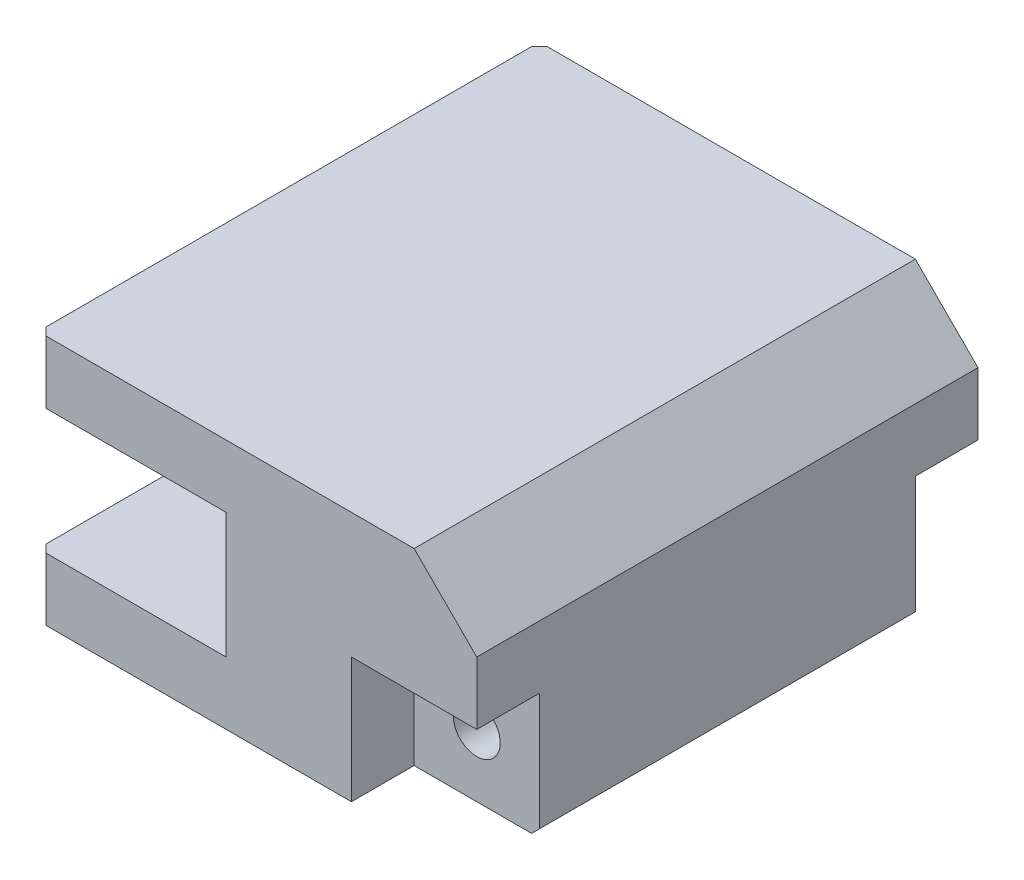
ISO-10303-21;
HEADER;
FILE_DESCRIPTION(('STEP AP214'),'2;1');
FILE_NAME('part.step','',(''),(''),'','','');
FILE_SCHEMA(('AUTOMOTIVE_DESIGN { 1 0 10303 214 1 1 1 1 }'));
ENDSEC;
DATA;
#1=APPLICATION_CONTEXT('core data for automotive mechanical design processes');
#2=APPLICATION_PROTOCOL_DEFINITION('international standard','automotive_design',2000,#1);
#3=PRODUCT_CONTEXT('',#1,'mechanical');
#4=PRODUCT('Part','Part','',(#3));
#5=PRODUCT_RELATED_PRODUCT_CATEGORY('part','',(#4));
#6=PRODUCT_DEFINITION_FORMATION('','',#4);
#7=PRODUCT_DEFINITION_CONTEXT('part definition',#1,'design');
#8=PRODUCT_DEFINITION('design','',#6,#7);
#9=PRODUCT_DEFINITION_SHAPE('','',#8);
#10=(LENGTH_UNIT() NAMED_UNIT(*) SI_UNIT(.MILLI.,.METRE.));
#11=(NAMED_UNIT(*) PLANE_ANGLE_UNIT() SI_UNIT($,.RADIAN.));
#12=(NAMED_UNIT(*) SI_UNIT($,.STERADIAN.) SOLID_ANGLE_UNIT());
#13=UNCERTAINTY_MEASURE_WITH_UNIT(LENGTH_MEASURE(1.E-05),#10,'distance_accuracy_value','');
#14=(GEOMETRIC_REPRESENTATION_CONTEXT(3) GLOBAL_UNCERTAINTY_ASSIGNED_CONTEXT((#13)) GLOBAL_UNIT_ASSIGNED_CONTEXT((#10,
#11,#12)) REPRESENTATION_CONTEXT('',''));
#15=CARTESIAN_POINT('',(0.,0.,0.));
#16=DIRECTION('',(0.,0.,1.));
#17=DIRECTION('',(1.,0.,0.));
#18=AXIS2_PLACEMENT_3D('',#15,#16,#17);
#19=CARTESIAN_POINT('',(-44.45,-25.4,50.8));
#20=DIRECTION('',(1.,0.,0.));
#21=DIRECTION('',(0.,0.,-1.));
#22=AXIS2_PLACEMENT_3D('',#19,#20,#21);
#23=PLANE('',#22);
#24=DIRECTION('',(0.,0.,-1.));
#25=VECTOR('',#24,1.);
#26=CARTESIAN_POINT('',(-44.45,25.4,50.8));
#27=LINE('',#26,#25);
#28=CARTESIAN_POINT('',(-44.45,25.4,49.2125));
#29=VERTEX_POINT('',#28);
#30=CARTESIAN_POINT('',(-44.45,25.4,-49.2125));
#31=VERTEX_POINT('',#30);
#32=EDGE_CURVE('E271',#29,#31,#27,.T.);
#33=ORIENTED_EDGE('',*,*,#32,.T.);
#34=DIRECTION('',(0.,-1.,0.));
#35=VECTOR('',#34,1.);
#36=CARTESIAN_POINT('',(-44.45,-25.4,-49.2125));
#37=LINE('',#36,#35);
#38=CARTESIAN_POINT('',(-44.45,12.7,-49.2125));
#39=VERTEX_POINT('',#38);
#40=EDGE_CURVE('E320',#31,#39,#37,.T.);
#41=ORIENTED_EDGE('',*,*,#40,.T.);
#42=DIRECTION('',(0.,0.,1.));
#43=VECTOR('',#42,1.);
#44=CARTESIAN_POINT('',(-44.45,12.7,-50.8));
#45=LINE('',#44,#43);
#46=CARTESIAN_POINT('',(-44.45,12.7,49.2125));
#47=VERTEX_POINT('',#46);
#48=EDGE_CURVE('E206',#39,#47,#45,.T.);
#49=ORIENTED_EDGE('',*,*,#48,.T.);
#50=DIRECTION('',(0.,1.,0.));
#51=VECTOR('',#50,1.);
#52=CARTESIAN_POINT('',(-44.45,25.4,49.2125));
#53=LINE('',#52,#51);
#54=EDGE_CURVE('E318',#47,#29,#53,.T.);
#55=ORIENTED_EDGE('',*,*,#54,.T.);
#56=EDGE_LOOP('',(#33,#41,#49,#55));
#57=FACE_BOUND('',#56,.T.);
#58=ADVANCED_FACE('F34',(#57),#23,.F.);
#59=CARTESIAN_POINT('',(44.45,-25.4,50.8));
#60=DIRECTION('',(0.,1.,0.));
#61=DIRECTION('',(-1.,0.,0.));
#62=AXIS2_PLACEMENT_3D('',#59,#60,#61);
#63=PLANE('',#62);
#64=DIRECTION('',(1.,0.,0.));
#65=VECTOR('',#64,1.);
#66=CARTESIAN_POINT('',(44.45,-25.4,50.8));
#67=LINE('',#66,#65);
#68=CARTESIAN_POINT('',(-42.8625,-25.4,50.8));
#69=VERTEX_POINT('',#68);
#70=CARTESIAN_POINT('',(19.05,-25.4,50.8));
#71=VERTEX_POINT('',#70);
#72=EDGE_CURVE('E262',#69,#71,#67,.T.);
#73=ORIENTED_EDGE('',*,*,#72,.F.);
#74=DIRECTION('',(-0.707106781186551,0.,-0.707106781186544));
#75=VECTOR('',#74,1.);
#76=CARTESIAN_POINT('',(-42.8625,-25.4,50.8));
#77=LINE('',#76,#75);
#78=CARTESIAN_POINT('',(-44.45,-25.4,49.2125));
#79=VERTEX_POINT('',#78);
#80=EDGE_CURVE('E304',#69,#79,#77,.T.);
#81=ORIENTED_EDGE('',*,*,#80,.T.);
#82=DIRECTION('',(0.,0.,-1.));
#83=VECTOR('',#82,1.);
#84=CARTESIAN_POINT('',(-44.45,-25.4,50.8));
#85=LINE('',#84,#83);
#86=CARTESIAN_POINT('',(-44.45,-25.4,-49.2125));
#87=VERTEX_POINT('',#86);
#88=EDGE_CURVE('E280',#79,#87,#85,.T.);
#89=ORIENTED_EDGE('',*,*,#88,.T.);
#90=DIRECTION('',(-0.707106781186544,0.,0.707106781186551));
#91=VECTOR('',#90,1.);
#92=CARTESIAN_POINT('',(-44.45,-25.4,-49.2125));
#93=LINE('',#92,#91);
#94=CARTESIAN_POINT('',(-42.8625,-25.4,-50.8));
#95=VERTEX_POINT('',#94);
#96=EDGE_CURVE('E302',#87,#95,#93,.F.);
#97=ORIENTED_EDGE('',*,*,#96,.T.);
#98=DIRECTION('',(1.,0.,0.));
#99=VECTOR('',#98,1.);
#100=CARTESIAN_POINT('',(44.45,-25.4,-50.8));
#101=LINE('',#100,#99);
#102=CARTESIAN_POINT('',(19.05,-25.4,-50.8));
#103=VERTEX_POINT('',#102);
#104=EDGE_CURVE('E258',#95,#103,#101,.T.);
#105=ORIENTED_EDGE('',*,*,#104,.T.);
#106=DIRECTION('',(0.,0.,-1.));
#107=VECTOR('',#106,1.);
#108=CARTESIAN_POINT('',(19.05,-25.4,-38.1));
#109=LINE('',#108,#107);
#110=CARTESIAN_POINT('',(19.05,-25.4,-38.1));
#111=VERTEX_POINT('',#110);
#112=EDGE_CURVE('E222',#111,#103,#109,.T.);
#113=ORIENTED_EDGE('',*,*,#112,.F.);
#114=DIRECTION('',(1.,0.,0.));
#115=VECTOR('',#114,1.);
#116=CARTESIAN_POINT('',(44.45,-25.4,-38.1));
#117=LINE('',#116,#115);
#118=CARTESIAN_POINT('',(42.8625,-25.4,-38.1));
#119=VERTEX_POINT('',#118);
#120=EDGE_CURVE('E214',#111,#119,#117,.T.);
#121=ORIENTED_EDGE('',*,*,#120,.T.);
#122=DIRECTION('',(0.,0.,1.));
#123=VECTOR('',#122,1.);
#124=CARTESIAN_POINT('',(42.8625,-25.4,50.8));
#125=LINE('',#124,#123);
#126=CARTESIAN_POINT('',(42.8625,-25.4,38.1));
#127=VERTEX_POINT('',#126);
#128=EDGE_CURVE('E300',#119,#127,#125,.T.);
#129=ORIENTED_EDGE('',*,*,#128,.T.);
#130=DIRECTION('',(1.,0.,0.));
#131=VECTOR('',#130,1.);
#132=CARTESIAN_POINT('',(44.45,-25.4,38.1));
#133=LINE('',#132,#131);
#134=CARTESIAN_POINT('',(19.05,-25.4,38.1));
#135=VERTEX_POINT('',#134);
#136=EDGE_CURVE('E248',#135,#127,#133,.T.);
#137=ORIENTED_EDGE('',*,*,#136,.F.);
#138=DIRECTION('',(0.,0.,1.));
#139=VECTOR('',#138,1.);
#140=CARTESIAN_POINT('',(19.05,-25.4,38.1));
#141=LINE('',#140,#139);
#142=EDGE_CURVE('E255',#135,#71,#141,.T.);
#143=ORIENTED_EDGE('',*,*,#142,.T.);
#144=EDGE_LOOP('',(#73,#81,#89,#97,#105,#113,#121,#129,#137,#143));
#145=FACE_BOUND('',#144,.T.);
#146=ADVANCED_FACE('F342',(#145),#63,.F.);
#147=CARTESIAN_POINT('',(44.45,-25.4,50.8));
#148=DIRECTION('',(-1.,0.,0.));
#149=DIRECTION('',(0.,0.,1.));
#150=AXIS2_PLACEMENT_3D('',#147,#148,#149);
#151=PLANE('',#150);
#152=DIRECTION('',(0.,1.,0.));
#153=VECTOR('',#152,1.);
#154=CARTESIAN_POINT('',(44.45,-25.4,38.1));
#155=LINE('',#154,#153);
#156=CARTESIAN_POINT('',(44.45,-23.8125,38.1));
#157=VERTEX_POINT('',#156);
#158=CARTESIAN_POINT('',(44.45,0.,38.1));
#159=VERTEX_POINT('',#158);
#160=EDGE_CURVE('E239',#157,#159,#155,.T.);
#161=ORIENTED_EDGE('',*,*,#160,.F.);
#162=DIRECTION('',(0.,0.,-1.));
#163=VECTOR('',#162,1.);
#164=CARTESIAN_POINT('',(44.45,-23.8125,50.8));
#165=LINE('',#164,#163);
#166=CARTESIAN_POINT('',(44.45,-23.8125,-38.1));
#167=VERTEX_POINT('',#166);
#168=EDGE_CURVE('E331',#157,#167,#165,.T.);
#169=ORIENTED_EDGE('',*,*,#168,.T.);
#170=DIRECTION('',(0.,1.,0.));
#171=VECTOR('',#170,1.);
#172=CARTESIAN_POINT('',(44.45,-25.4,-38.1));
#173=LINE('',#172,#171);
#174=CARTESIAN_POINT('',(44.45,0.,-38.1));
#175=VERTEX_POINT('',#174);
#176=EDGE_CURVE('E212',#167,#175,#173,.T.);
#177=ORIENTED_EDGE('',*,*,#176,.T.);
#178=DIRECTION('',(0.,0.,-1.));
#179=VECTOR('',#178,1.);
#180=CARTESIAN_POINT('',(44.45,0.,-38.1));
#181=LINE('',#180,#179);
#182=CARTESIAN_POINT('',(44.45,0.,-50.8));
#183=VERTEX_POINT('',#182);
#184=EDGE_CURVE('E227',#175,#183,#181,.T.);
#185=ORIENTED_EDGE('',*,*,#184,.T.);
#186=DIRECTION('',(0.,1.,0.));
#187=VECTOR('',#186,1.);
#188=CARTESIAN_POINT('',(44.45,-25.4,-50.8));
#189=LINE('',#188,#187);
#190=CARTESIAN_POINT('',(44.45,12.7,-50.8));
#191=VERTEX_POINT('',#190);
#192=EDGE_CURVE('E273',#183,#191,#189,.T.);
#193=ORIENTED_EDGE('',*,*,#192,.T.);
#194=DIRECTION('',(0.,0.,1.));
#195=VECTOR('',#194,1.);
#196=CARTESIAN_POINT('',(44.45,12.7,50.8));
#197=LINE('',#196,#195);
#198=CARTESIAN_POINT('',(44.45,12.7,50.8));
#199=VERTEX_POINT('',#198);
#200=EDGE_CURVE('E290',#191,#199,#197,.T.);
#201=ORIENTED_EDGE('',*,*,#200,.T.);
#202=DIRECTION('',(0.,1.,0.));
#203=VECTOR('',#202,1.);
#204=CARTESIAN_POINT('',(44.45,-25.4,50.8));
#205=LINE('',#204,#203);
#206=CARTESIAN_POINT('',(44.45,0.,50.8));
#207=VERTEX_POINT('',#206);
#208=EDGE_CURVE('E264',#207,#199,#205,.T.);
#209=ORIENTED_EDGE('',*,*,#208,.F.);
#210=DIRECTION('',(0.,0.,1.));
#211=VECTOR('',#210,1.);
#212=CARTESIAN_POINT('',(44.45,0.,38.1));
#213=LINE('',#212,#211);
#214=EDGE_CURVE('E250',#159,#207,#213,.T.);
#215=ORIENTED_EDGE('',*,*,#214,.F.);
#216=EDGE_LOOP('',(#161,#169,#177,#185,#193,#201,#209,#215));
#217=FACE_BOUND('',#216,.T.);
#218=ADVANCED_FACE('F345',(#217),#151,.F.);
#219=CARTESIAN_POINT('',(0.,0.,-50.8));
#220=DIRECTION('',(0.,0.,1.));
#221=DIRECTION('',(1.,0.,0.));
#222=AXIS2_PLACEMENT_3D('',#219,#220,#221);
#223=PLANE('',#222);
#224=ORIENTED_EDGE('',*,*,#104,.F.);
#225=DIRECTION('',(0.,1.,0.));
#226=VECTOR('',#225,1.);
#227=CARTESIAN_POINT('',(-42.8625,0.,-50.8));
#228=LINE('',#227,#226);
#229=CARTESIAN_POINT('',(-42.8625,-12.7,-50.8));
#230=VERTEX_POINT('',#229);
#231=EDGE_CURVE('E178',#95,#230,#228,.T.);
#232=ORIENTED_EDGE('',*,*,#231,.T.);
#233=DIRECTION('',(1.,0.,0.));
#234=VECTOR('',#233,1.);
#235=CARTESIAN_POINT('',(-44.45,-12.7,-50.8));
#236=LINE('',#235,#234);
#237=CARTESIAN_POINT('',(-6.35,-12.7,-50.8));
#238=VERTEX_POINT('',#237);
#239=EDGE_CURVE('E170',#230,#238,#236,.T.);
#240=ORIENTED_EDGE('',*,*,#239,.T.);
#241=DIRECTION('',(0.,1.,0.));
#242=VECTOR('',#241,1.);
#243=CARTESIAN_POINT('',(-6.35,12.7,-50.8));
#244=LINE('',#243,#242);
#245=CARTESIAN_POINT('',(-6.35,12.7,-50.8));
#246=VERTEX_POINT('',#245);
#247=EDGE_CURVE('E176',#238,#246,#244,.T.);
#248=ORIENTED_EDGE('',*,*,#247,.T.);
#249=DIRECTION('',(-1.,0.,0.));
#250=VECTOR('',#249,1.);
#251=CARTESIAN_POINT('',(-44.45,12.7,-50.8));
#252=LINE('',#251,#250);
#253=CARTESIAN_POINT('',(-42.8625,12.7,-50.8));
#254=VERTEX_POINT('',#253);
#255=EDGE_CURVE('E197',#246,#254,#252,.T.);
#256=ORIENTED_EDGE('',*,*,#255,.T.);
#257=DIRECTION('',(0.,1.,0.));
#258=VECTOR('',#257,1.);
#259=CARTESIAN_POINT('',(-42.8625,0.,-50.8));
#260=LINE('',#259,#258);
#261=CARTESIAN_POINT('',(-42.8625,25.4,-50.8));
#262=VERTEX_POINT('',#261);
#263=EDGE_CURVE('E315',#254,#262,#260,.T.);
#264=ORIENTED_EDGE('',*,*,#263,.T.);
#265=DIRECTION('',(-1.,0.,0.));
#266=VECTOR('',#265,1.);
#267=CARTESIAN_POINT('',(44.45,25.4,-50.8));
#268=LINE('',#267,#266);
#269=CARTESIAN_POINT('',(31.75,25.4,-50.8));
#270=VERTEX_POINT('',#269);
#271=EDGE_CURVE('E265',#270,#262,#268,.T.);
#272=ORIENTED_EDGE('',*,*,#271,.F.);
#273=DIRECTION('',(-0.707106781186546,0.707106781186549,0.));
#274=VECTOR('',#273,1.);
#275=CARTESIAN_POINT('',(31.75,25.4,-50.8));
#276=LINE('',#275,#274);
#277=EDGE_CURVE('E288',#270,#191,#276,.F.);
#278=ORIENTED_EDGE('',*,*,#277,.T.);
#279=ORIENTED_EDGE('',*,*,#192,.F.);
#280=DIRECTION('',(-1.,0.,0.));
#281=VECTOR('',#280,1.);
#282=CARTESIAN_POINT('',(44.45,0.,-50.8));
#283=LINE('',#282,#281);
#284=CARTESIAN_POINT('',(19.05,0.,-50.8));
#285=VERTEX_POINT('',#284);
#286=EDGE_CURVE('E215',#183,#285,#283,.T.);
#287=ORIENTED_EDGE('',*,*,#286,.T.);
#288=DIRECTION('',(0.,-1.,0.));
#289=VECTOR('',#288,1.);
#290=CARTESIAN_POINT('',(19.05,-25.4,-50.8));
#291=LINE('',#290,#289);
#292=EDGE_CURVE('E209',#285,#103,#291,.T.);
#293=ORIENTED_EDGE('',*,*,#292,.T.);
#294=EDGE_LOOP('',(#224,#232,#240,#248,#256,#264,#272,#278,#279,#287,#293));
#295=FACE_BOUND('',#294,.T.);
#296=ADVANCED_FACE('F173',(#295),#223,.F.);
#297=CARTESIAN_POINT('',(31.75,-12.7,-50.8));
#298=DIRECTION('',(0.,0.,1.));
#299=DIRECTION('',(1.,0.,0.));
#300=AXIS2_PLACEMENT_3D('',#297,#298,#299);
#301=CYLINDRICAL_SURFACE('',#300,4.7625);
#302=CARTESIAN_POINT('',(31.75,-12.7,38.1));
#303=DIRECTION('',(0.,0.,1.));
#304=DIRECTION('',(1.,0.,0.));
#305=AXIS2_PLACEMENT_3D('',#302,#303,#304);
#306=CIRCLE('',#305,4.7625);
#307=CARTESIAN_POINT('',(36.5125,-12.7,38.1));
#308=VERTEX_POINT('',#307);
#309=EDGE_CURVE('E235',#308,#308,#306,.T.);
#310=ORIENTED_EDGE('',*,*,#309,.T.);
#311=EDGE_LOOP('',(#310));
#312=FACE_BOUND('',#311,.T.);
#313=CARTESIAN_POINT('',(31.75,-12.7,-38.1));
#314=DIRECTION('',(0.,0.,-1.));
#315=DIRECTION('',(-1.,0.,0.));
#316=AXIS2_PLACEMENT_3D('',#313,#314,#315);
#317=CIRCLE('',#316,4.7625);
#318=CARTESIAN_POINT('',(26.9875,-12.7,-38.1));
#319=VERTEX_POINT('',#318);
#320=EDGE_CURVE('E230',#319,#319,#317,.F.);
#321=ORIENTED_EDGE('',*,*,#320,.F.);
#322=EDGE_LOOP('',(#321));
#323=FACE_BOUND('',#322,.T.);
#324=ADVANCED_FACE('F419',(#312,#323),#301,.F.);
#325=ORIENTED_EDGE('',*,*,#88,.F.);
#326=DIRECTION('',(0.,1.,0.));
#327=VECTOR('',#326,1.);
#328=CARTESIAN_POINT('',(-44.45,-12.7,49.2125));
#329=LINE('',#328,#327);
#330=CARTESIAN_POINT('',(-44.45,-12.7,49.2125));
#331=VERTEX_POINT('',#330);
#332=EDGE_CURVE('E309',#79,#331,#329,.T.);
#333=ORIENTED_EDGE('',*,*,#332,.T.);
#334=DIRECTION('',(0.,0.,1.));
#335=VECTOR('',#334,1.);
#336=CARTESIAN_POINT('',(-44.45,-12.7,-50.8));
#337=LINE('',#336,#335);
#338=CARTESIAN_POINT('',(-44.45,-12.7,-49.2125));
#339=VERTEX_POINT('',#338);
#340=EDGE_CURVE('E193',#339,#331,#337,.T.);
#341=ORIENTED_EDGE('',*,*,#340,.F.);
#342=DIRECTION('',(0.,-1.,0.));
#343=VECTOR('',#342,1.);
#344=CARTESIAN_POINT('',(-44.45,-25.4,-49.2125));
#345=LINE('',#344,#343);
#346=EDGE_CURVE('E306',#339,#87,#345,.T.);
#347=ORIENTED_EDGE('',*,*,#346,.T.);
#348=EDGE_LOOP('',(#325,#333,#341,#347));
#349=FACE_BOUND('',#348,.T.);
#350=ADVANCED_FACE('F367',(#349),#23,.F.);
#351=CARTESIAN_POINT('',(44.45,25.4,50.8));
#352=DIRECTION('',(0.,-1.,0.));
#353=DIRECTION('',(1.,0.,0.));
#354=AXIS2_PLACEMENT_3D('',#351,#352,#353);
#355=PLANE('',#354);
#356=ORIENTED_EDGE('',*,*,#271,.T.);
#357=DIRECTION('',(0.707106781186544,0.,-0.707106781186551));
#358=VECTOR('',#357,1.);
#359=CARTESIAN_POINT('',(-44.45,25.4,-49.2125));
#360=LINE('',#359,#358);
#361=EDGE_CURVE('E329',#262,#31,#360,.F.);
#362=ORIENTED_EDGE('',*,*,#361,.T.);
#363=ORIENTED_EDGE('',*,*,#32,.F.);
#364=DIRECTION('',(0.707106781186551,0.,0.707106781186544));
#365=VECTOR('',#364,1.);
#366=CARTESIAN_POINT('',(-42.8625,25.4,50.8));
#367=LINE('',#366,#365);
#368=CARTESIAN_POINT('',(-42.8625,25.4,50.8));
#369=VERTEX_POINT('',#368);
#370=EDGE_CURVE('E327',#29,#369,#367,.T.);
#371=ORIENTED_EDGE('',*,*,#370,.T.);
#372=DIRECTION('',(-1.,0.,0.));
#373=VECTOR('',#372,1.);
#374=CARTESIAN_POINT('',(44.45,25.4,50.8));
#375=LINE('',#374,#373);
#376=CARTESIAN_POINT('',(31.75,25.4,50.8));
#377=VERTEX_POINT('',#376);
#378=EDGE_CURVE('E268',#377,#369,#375,.T.);
#379=ORIENTED_EDGE('',*,*,#378,.F.);
#380=DIRECTION('',(0.,0.,-1.));
#381=VECTOR('',#380,1.);
#382=CARTESIAN_POINT('',(31.75,25.4,50.8));
#383=LINE('',#382,#381);
#384=EDGE_CURVE('E283',#377,#270,#383,.T.);
#385=ORIENTED_EDGE('',*,*,#384,.T.);
#386=EDGE_LOOP('',(#356,#362,#363,#371,#379,#385));
#387=FACE_BOUND('',#386,.T.);
#388=ADVANCED_FACE('F387',(#387),#355,.F.);
#389=CARTESIAN_POINT('',(0.,0.,50.8));
#390=DIRECTION('',(0.,0.,1.));
#391=DIRECTION('',(1.,0.,0.));
#392=AXIS2_PLACEMENT_3D('',#389,#390,#391);
#393=PLANE('',#392);
#394=DIRECTION('',(1.,0.,0.));
#395=VECTOR('',#394,1.);
#396=CARTESIAN_POINT('',(-44.45,-12.7,50.8));
#397=LINE('',#396,#395);
#398=CARTESIAN_POINT('',(-42.8625,-12.7,50.8));
#399=VERTEX_POINT('',#398);
#400=CARTESIAN_POINT('',(-6.35,-12.7,50.8));
#401=VERTEX_POINT('',#400);
#402=EDGE_CURVE('E188',#399,#401,#397,.T.);
#403=ORIENTED_EDGE('',*,*,#402,.F.);
#404=DIRECTION('',(0.,-1.,0.));
#405=VECTOR('',#404,1.);
#406=CARTESIAN_POINT('',(-42.8625,-25.4,50.8));
#407=LINE('',#406,#405);
#408=EDGE_CURVE('E297',#399,#69,#407,.T.);
#409=ORIENTED_EDGE('',*,*,#408,.T.);
#410=ORIENTED_EDGE('',*,*,#72,.T.);
#411=DIRECTION('',(0.,-1.,0.));
#412=VECTOR('',#411,1.);
#413=CARTESIAN_POINT('',(19.05,-25.4,50.8));
#414=LINE('',#413,#412);
#415=CARTESIAN_POINT('',(19.05,0.,50.8));
#416=VERTEX_POINT('',#415);
#417=EDGE_CURVE('E242',#416,#71,#414,.T.);
#418=ORIENTED_EDGE('',*,*,#417,.F.);
#419=DIRECTION('',(-1.,0.,0.));
#420=VECTOR('',#419,1.);
#421=CARTESIAN_POINT('',(44.45,0.,50.8));
#422=LINE('',#421,#420);
#423=EDGE_CURVE('E238',#207,#416,#422,.T.);
#424=ORIENTED_EDGE('',*,*,#423,.F.);
#425=ORIENTED_EDGE('',*,*,#208,.T.);
#426=DIRECTION('',(0.707106781186546,-0.707106781186549,0.));
#427=VECTOR('',#426,1.);
#428=CARTESIAN_POINT('',(28.575,28.5749999999999,50.8));
#429=LINE('',#428,#427);
#430=EDGE_CURVE('E292',#199,#377,#429,.F.);
#431=ORIENTED_EDGE('',*,*,#430,.T.);
#432=ORIENTED_EDGE('',*,*,#378,.T.);
#433=DIRECTION('',(0.,-1.,0.));
#434=VECTOR('',#433,1.);
#435=CARTESIAN_POINT('',(-42.8625,12.7,50.8));
#436=LINE('',#435,#434);
#437=CARTESIAN_POINT('',(-42.8625,12.7,50.8));
#438=VERTEX_POINT('',#437);
#439=EDGE_CURVE('E294',#369,#438,#436,.T.);
#440=ORIENTED_EDGE('',*,*,#439,.T.);
#441=DIRECTION('',(-1.,0.,0.));
#442=VECTOR('',#441,1.);
#443=CARTESIAN_POINT('',(-44.45,12.7,50.8));
#444=LINE('',#443,#442);
#445=CARTESIAN_POINT('',(-6.35,12.7,50.8));
#446=VERTEX_POINT('',#445);
#447=EDGE_CURVE('E181',#446,#438,#444,.T.);
#448=ORIENTED_EDGE('',*,*,#447,.F.);
#449=DIRECTION('',(0.,1.,0.));
#450=VECTOR('',#449,1.);
#451=CARTESIAN_POINT('',(-6.35,12.7,50.8));
#452=LINE('',#451,#450);
#453=EDGE_CURVE('E202',#401,#446,#452,.T.);
#454=ORIENTED_EDGE('',*,*,#453,.F.);
#455=EDGE_LOOP('',(#403,#409,#410,#418,#424,#425,#431,#432,#440,#448,#454));
#456=FACE_BOUND('',#455,.T.);
#457=ADVANCED_FACE('F359',(#456),#393,.T.);
#458=CARTESIAN_POINT('',(19.05,-25.4,38.1));
#459=DIRECTION('',(-1.,0.,0.));
#460=DIRECTION('',(0.,0.,1.));
#461=AXIS2_PLACEMENT_3D('',#458,#459,#460);
#462=PLANE('',#461);
#463=ORIENTED_EDGE('',*,*,#417,.T.);
#464=ORIENTED_EDGE('',*,*,#142,.F.);
#465=DIRECTION('',(0.,-1.,0.));
#466=VECTOR('',#465,1.);
#467=CARTESIAN_POINT('',(19.05,-25.4,38.1));
#468=LINE('',#467,#466);
#469=CARTESIAN_POINT('',(19.05,0.,38.1));
#470=VERTEX_POINT('',#469);
#471=EDGE_CURVE('E245',#470,#135,#468,.T.);
#472=ORIENTED_EDGE('',*,*,#471,.F.);
#473=DIRECTION('',(0.,0.,1.));
#474=VECTOR('',#473,1.);
#475=CARTESIAN_POINT('',(19.05,0.,38.1));
#476=LINE('',#475,#474);
#477=EDGE_CURVE('E259',#470,#416,#476,.T.);
#478=ORIENTED_EDGE('',*,*,#477,.T.);
#479=EDGE_LOOP('',(#463,#464,#472,#478));
#480=FACE_BOUND('',#479,.T.);
#481=ADVANCED_FACE('F356',(#480),#462,.F.);
#482=CARTESIAN_POINT('',(44.45,0.,38.1));
#483=DIRECTION('',(0.,1.,0.));
#484=DIRECTION('',(-1.,0.,0.));
#485=AXIS2_PLACEMENT_3D('',#482,#483,#484);
#486=PLANE('',#485);
#487=ORIENTED_EDGE('',*,*,#423,.T.);
#488=ORIENTED_EDGE('',*,*,#477,.F.);
#489=DIRECTION('',(-1.,0.,0.));
#490=VECTOR('',#489,1.);
#491=CARTESIAN_POINT('',(44.45,0.,38.1));
#492=LINE('',#491,#490);
#493=EDGE_CURVE('E241',#159,#470,#492,.T.);
#494=ORIENTED_EDGE('',*,*,#493,.F.);
#495=ORIENTED_EDGE('',*,*,#214,.T.);
#496=EDGE_LOOP('',(#487,#488,#494,#495));
#497=FACE_BOUND('',#496,.T.);
#498=ADVANCED_FACE('F351',(#497),#486,.F.);
#499=CARTESIAN_POINT('',(0.,0.,38.1));
#500=DIRECTION('',(0.,0.,1.));
#501=DIRECTION('',(1.,0.,0.));
#502=AXIS2_PLACEMENT_3D('',#499,#500,#501);
#503=PLANE('',#502);
#504=ORIENTED_EDGE('',*,*,#309,.F.);
#505=EDGE_LOOP('',(#504));
#506=FACE_BOUND('',#505,.T.);
#507=ORIENTED_EDGE('',*,*,#136,.T.);
#508=DIRECTION('',(-0.707106781186548,-0.707106781186548,0.));
#509=VECTOR('',#508,1.);
#510=CARTESIAN_POINT('',(34.13125,-34.13125,38.1));
#511=LINE('',#510,#509);
#512=EDGE_CURVE('E11',#127,#157,#511,.F.);
#513=ORIENTED_EDGE('',*,*,#512,.T.);
#514=ORIENTED_EDGE('',*,*,#160,.T.);
#515=ORIENTED_EDGE('',*,*,#493,.T.);
#516=ORIENTED_EDGE('',*,*,#471,.T.);
#517=EDGE_LOOP('',(#507,#513,#514,#515,#516));
#518=FACE_BOUND('',#517,.T.);
#519=ADVANCED_FACE('F349',(#506,#518),#503,.T.);
#520=CARTESIAN_POINT('',(0.,0.,-38.1));
#521=DIRECTION('',(0.,0.,-1.));
#522=DIRECTION('',(1.,0.,0.));
#523=AXIS2_PLACEMENT_3D('',#520,#521,#522);
#524=PLANE('',#523);
#525=ORIENTED_EDGE('',*,*,#176,.F.);
#526=DIRECTION('',(0.707106781186548,0.707106781186548,0.));
#527=VECTOR('',#526,1.);
#528=CARTESIAN_POINT('',(34.13125,-34.13125,-38.1));
#529=LINE('',#528,#527);
#530=EDGE_CURVE('E42',#167,#119,#529,.F.);
#531=ORIENTED_EDGE('',*,*,#530,.T.);
#532=ORIENTED_EDGE('',*,*,#120,.F.);
#533=DIRECTION('',(0.,-1.,0.));
#534=VECTOR('',#533,1.);
#535=CARTESIAN_POINT('',(19.05,-25.4,-38.1));
#536=LINE('',#535,#534);
#537=CARTESIAN_POINT('',(19.05,0.,-38.1));
#538=VERTEX_POINT('',#537);
#539=EDGE_CURVE('E218',#538,#111,#536,.T.);
#540=ORIENTED_EDGE('',*,*,#539,.F.);
#541=DIRECTION('',(-1.,0.,0.));
#542=VECTOR('',#541,1.);
#543=CARTESIAN_POINT('',(44.45,0.,-38.1));
#544=LINE('',#543,#542);
#545=EDGE_CURVE('E220',#175,#538,#544,.T.);
#546=ORIENTED_EDGE('',*,*,#545,.F.);
#547=EDGE_LOOP('',(#525,#531,#532,#540,#546));
#548=FACE_BOUND('',#547,.T.);
#549=ORIENTED_EDGE('',*,*,#320,.T.);
#550=EDGE_LOOP('',(#549));
#551=FACE_BOUND('',#550,.T.);
#552=ADVANCED_FACE('F335',(#548,#551),#524,.T.);
#553=CARTESIAN_POINT('',(44.45,0.,-38.1));
#554=DIRECTION('',(0.,-1.,0.));
#555=DIRECTION('',(1.,0.,0.));
#556=AXIS2_PLACEMENT_3D('',#553,#554,#555);
#557=PLANE('',#556);
#558=ORIENTED_EDGE('',*,*,#286,.F.);
#559=ORIENTED_EDGE('',*,*,#184,.F.);
#560=ORIENTED_EDGE('',*,*,#545,.T.);
#561=DIRECTION('',(0.,0.,-1.));
#562=VECTOR('',#561,1.);
#563=CARTESIAN_POINT('',(19.05,0.,-38.1));
#564=LINE('',#563,#562);
#565=EDGE_CURVE('E231',#538,#285,#564,.T.);
#566=ORIENTED_EDGE('',*,*,#565,.T.);
#567=EDGE_LOOP('',(#558,#559,#560,#566));
#568=FACE_BOUND('',#567,.T.);
#569=ADVANCED_FACE('F378',(#568),#557,.T.);
#570=CARTESIAN_POINT('',(19.05,-25.4,-38.1));
#571=DIRECTION('',(1.,0.,0.));
#572=DIRECTION('',(0.,0.,-1.));
#573=AXIS2_PLACEMENT_3D('',#570,#571,#572);
#574=PLANE('',#573);
#575=ORIENTED_EDGE('',*,*,#292,.F.);
#576=ORIENTED_EDGE('',*,*,#565,.F.);
#577=ORIENTED_EDGE('',*,*,#539,.T.);
#578=ORIENTED_EDGE('',*,*,#112,.T.);
#579=EDGE_LOOP('',(#575,#576,#577,#578));
#580=FACE_BOUND('',#579,.T.);
#581=ADVANCED_FACE('F375',(#580),#574,.T.);
#582=CARTESIAN_POINT('',(-44.45,12.7,-50.8));
#583=DIRECTION('',(0.,1.,0.));
#584=DIRECTION('',(0.,0.,1.));
#585=AXIS2_PLACEMENT_3D('',#582,#583,#584);
#586=PLANE('',#585);
#587=ORIENTED_EDGE('',*,*,#48,.F.);
#588=DIRECTION('',(-0.707106781186544,0.,0.707106781186551));
#589=VECTOR('',#588,1.);
#590=CARTESIAN_POINT('',(-44.45,12.7,-49.2125));
#591=LINE('',#590,#589);
#592=EDGE_CURVE('E325',#39,#254,#591,.F.);
#593=ORIENTED_EDGE('',*,*,#592,.T.);
#594=ORIENTED_EDGE('',*,*,#255,.F.);
#595=DIRECTION('',(0.,0.,1.));
#596=VECTOR('',#595,1.);
#597=CARTESIAN_POINT('',(-6.35,12.7,-50.8));
#598=LINE('',#597,#596);
#599=EDGE_CURVE('E192',#246,#446,#598,.T.);
#600=ORIENTED_EDGE('',*,*,#599,.T.);
#601=ORIENTED_EDGE('',*,*,#447,.T.);
#602=DIRECTION('',(-0.707106781186551,0.,-0.707106781186544));
#603=VECTOR('',#602,1.);
#604=CARTESIAN_POINT('',(-42.8625,12.7,50.8));
#605=LINE('',#604,#603);
#606=EDGE_CURVE('E323',#438,#47,#605,.T.);
#607=ORIENTED_EDGE('',*,*,#606,.T.);
#608=EDGE_LOOP('',(#587,#593,#594,#600,#601,#607));
#609=FACE_BOUND('',#608,.T.);
#610=ADVANCED_FACE('F398',(#609),#586,.F.);
#611=CARTESIAN_POINT('',(-6.35,12.7,-50.8));
#612=DIRECTION('',(1.,0.,0.));
#613=DIRECTION('',(0.,1.,0.));
#614=AXIS2_PLACEMENT_3D('',#611,#612,#613);
#615=PLANE('',#614);
#616=ORIENTED_EDGE('',*,*,#453,.T.);
#617=ORIENTED_EDGE('',*,*,#599,.F.);
#618=ORIENTED_EDGE('',*,*,#247,.F.);
#619=DIRECTION('',(0.,0.,1.));
#620=VECTOR('',#619,1.);
#621=CARTESIAN_POINT('',(-6.35,-12.7,-50.8));
#622=LINE('',#621,#620);
#623=EDGE_CURVE('E184',#238,#401,#622,.T.);
#624=ORIENTED_EDGE('',*,*,#623,.T.);
#625=EDGE_LOOP('',(#616,#617,#618,#624));
#626=FACE_BOUND('',#625,.T.);
#627=ADVANCED_FACE('F195',(#626),#615,.F.);
#628=CARTESIAN_POINT('',(-44.45,-12.7,-50.8));
#629=DIRECTION('',(0.,-1.,0.));
#630=DIRECTION('',(0.,0.,-1.));
#631=AXIS2_PLACEMENT_3D('',#628,#629,#630);
#632=PLANE('',#631);
#633=ORIENTED_EDGE('',*,*,#340,.T.);
#634=DIRECTION('',(0.707106781186551,0.,0.707106781186544));
#635=VECTOR('',#634,1.);
#636=CARTESIAN_POINT('',(-42.8625,-12.7,50.8));
#637=LINE('',#636,#635);
#638=EDGE_CURVE('E313',#331,#399,#637,.T.);
#639=ORIENTED_EDGE('',*,*,#638,.T.);
#640=ORIENTED_EDGE('',*,*,#402,.T.);
#641=ORIENTED_EDGE('',*,*,#623,.F.);
#642=ORIENTED_EDGE('',*,*,#239,.F.);
#643=DIRECTION('',(0.707106781186544,0.,-0.707106781186551));
#644=VECTOR('',#643,1.);
#645=CARTESIAN_POINT('',(-44.45,-12.7,-49.2125));
#646=LINE('',#645,#644);
#647=EDGE_CURVE('E311',#230,#339,#646,.F.);
#648=ORIENTED_EDGE('',*,*,#647,.T.);
#649=EDGE_LOOP('',(#633,#639,#640,#641,#642,#648));
#650=FACE_BOUND('',#649,.T.);
#651=ADVANCED_FACE('F186',(#650),#632,.F.);
#652=CARTESIAN_POINT('',(31.75,25.4,50.8));
#653=DIRECTION('',(-0.707106781186549,-0.707106781186546,0.));
#654=DIRECTION('',(0.,0.,-1.));
#655=AXIS2_PLACEMENT_3D('',#652,#653,#654);
#656=PLANE('',#655);
#657=ORIENTED_EDGE('',*,*,#430,.F.);
#658=ORIENTED_EDGE('',*,*,#200,.F.);
#659=ORIENTED_EDGE('',*,*,#277,.F.);
#660=ORIENTED_EDGE('',*,*,#384,.F.);
#661=EDGE_LOOP('',(#657,#658,#659,#660));
#662=FACE_BOUND('',#661,.T.);
#663=ADVANCED_FACE('F384',(#662),#656,.F.);
#664=CARTESIAN_POINT('',(-42.8625,0.,50.8));
#665=DIRECTION('',(-0.707106781186544,0.,0.707106781186551));
#666=DIRECTION('',(0.,1.,0.));
#667=AXIS2_PLACEMENT_3D('',#664,#665,#666);
#668=PLANE('',#667);
#669=ORIENTED_EDGE('',*,*,#638,.F.);
#670=ORIENTED_EDGE('',*,*,#332,.F.);
#671=ORIENTED_EDGE('',*,*,#80,.F.);
#672=ORIENTED_EDGE('',*,*,#408,.F.);
#673=EDGE_LOOP('',(#669,#670,#671,#672));
#674=FACE_BOUND('',#673,.T.);
#675=ADVANCED_FACE('F363',(#674),#668,.T.);
#676=CARTESIAN_POINT('',(-44.45,-25.4,-49.2125));
#677=DIRECTION('',(0.707106781186551,0.,0.707106781186544));
#678=DIRECTION('',(0.,-1.,0.));
#679=AXIS2_PLACEMENT_3D('',#676,#677,#678);
#680=PLANE('',#679);
#681=ORIENTED_EDGE('',*,*,#647,.F.);
#682=ORIENTED_EDGE('',*,*,#231,.F.);
#683=ORIENTED_EDGE('',*,*,#96,.F.);
#684=ORIENTED_EDGE('',*,*,#346,.F.);
#685=EDGE_LOOP('',(#681,#682,#683,#684));
#686=FACE_BOUND('',#685,.T.);
#687=ADVANCED_FACE('F370',(#686),#680,.F.);
#688=CARTESIAN_POINT('',(-44.45,-25.4,-49.2125));
#689=DIRECTION('',(0.707106781186551,0.,0.707106781186544));
#690=DIRECTION('',(0.,-1.,0.));
#691=AXIS2_PLACEMENT_3D('',#688,#689,#690);
#692=PLANE('',#691);
#693=ORIENTED_EDGE('',*,*,#361,.F.);
#694=ORIENTED_EDGE('',*,*,#263,.F.);
#695=ORIENTED_EDGE('',*,*,#592,.F.);
#696=ORIENTED_EDGE('',*,*,#40,.F.);
#697=EDGE_LOOP('',(#693,#694,#695,#696));
#698=FACE_BOUND('',#697,.T.);
#699=ADVANCED_FACE('F402',(#698),#692,.F.);
#700=CARTESIAN_POINT('',(-42.8625,0.,50.8));
#701=DIRECTION('',(-0.707106781186544,0.,0.707106781186551));
#702=DIRECTION('',(0.,1.,0.));
#703=AXIS2_PLACEMENT_3D('',#700,#701,#702);
#704=PLANE('',#703);
#705=ORIENTED_EDGE('',*,*,#370,.F.);
#706=ORIENTED_EDGE('',*,*,#54,.F.);
#707=ORIENTED_EDGE('',*,*,#606,.F.);
#708=ORIENTED_EDGE('',*,*,#439,.F.);
#709=EDGE_LOOP('',(#705,#706,#707,#708));
#710=FACE_BOUND('',#709,.T.);
#711=ADVANCED_FACE('F394',(#710),#704,.T.);
#712=CARTESIAN_POINT('',(44.45,-23.8125,50.8));
#713=DIRECTION('',(-0.707106781186547,0.707106781186547,0.));
#714=DIRECTION('',(0.,0.,-1.));
#715=AXIS2_PLACEMENT_3D('',#712,#713,#714);
#716=PLANE('',#715);
#717=ORIENTED_EDGE('',*,*,#512,.F.);
#718=ORIENTED_EDGE('',*,*,#128,.F.);
#719=ORIENTED_EDGE('',*,*,#530,.F.);
#720=ORIENTED_EDGE('',*,*,#168,.F.);
#721=EDGE_LOOP('',(#717,#718,#719,#720));
#722=FACE_BOUND('',#721,.T.);
#723=ADVANCED_FACE('F36',(#722),#716,.F.);
#724=CLOSED_SHELL('',(#58,#146,#218,#296,#324,#350,#388,#457,#481,#498,#519,#552,#569,#581,#610,
#627,#651,#663,#675,#687,#699,#711,#723));
#725=MANIFOLD_SOLID_BREP('B2',#724);
#726=ADVANCED_BREP_SHAPE_REPRESENTATION('',(#18,#725),#14);
#727=SHAPE_DEFINITION_REPRESENTATION(#9,#726);
ENDSEC;
END-ISO-10303-21;
